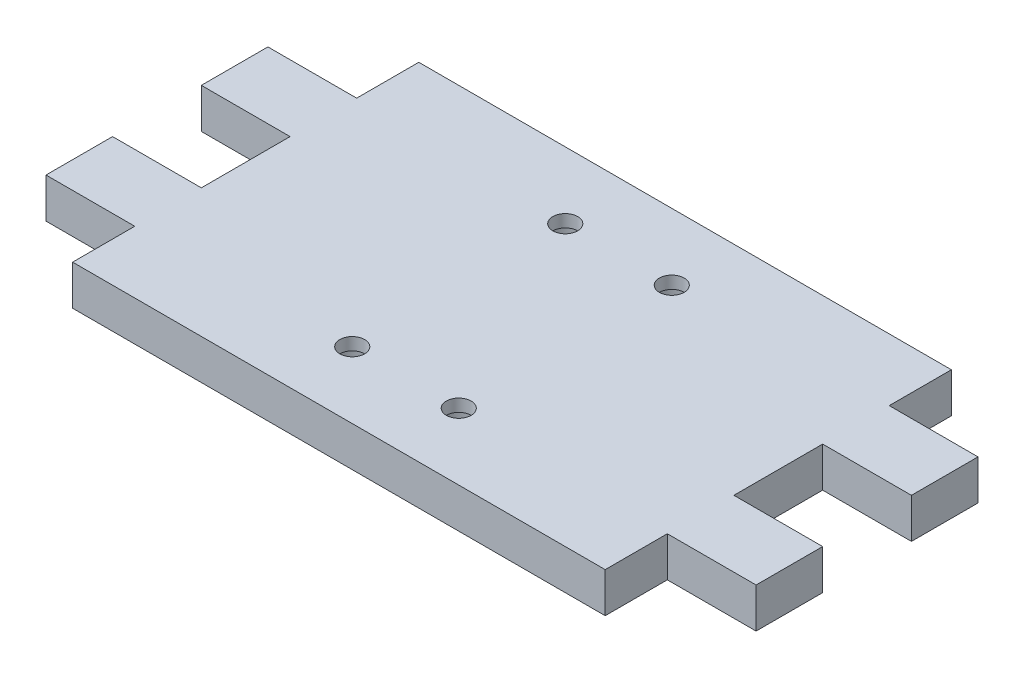
ISO-10303-21;
HEADER;
FILE_DESCRIPTION(('STEP AP214'),'2;1');
FILE_NAME('part.step','',(''),(''),'','','');
FILE_SCHEMA(('AUTOMOTIVE_DESIGN { 1 0 10303 214 1 1 1 1 }'));
ENDSEC;
DATA;
#1=APPLICATION_CONTEXT('core data for automotive mechanical design processes');
#2=APPLICATION_PROTOCOL_DEFINITION('international standard','automotive_design',2000,#1);
#3=PRODUCT_CONTEXT('',#1,'mechanical');
#4=PRODUCT('Part','Part','',(#3));
#5=PRODUCT_RELATED_PRODUCT_CATEGORY('part','',(#4));
#6=PRODUCT_DEFINITION_FORMATION('','',#4);
#7=PRODUCT_DEFINITION_CONTEXT('part definition',#1,'design');
#8=PRODUCT_DEFINITION('design','',#6,#7);
#9=PRODUCT_DEFINITION_SHAPE('','',#8);
#10=(LENGTH_UNIT() NAMED_UNIT(*) SI_UNIT(.MILLI.,.METRE.));
#11=(NAMED_UNIT(*) PLANE_ANGLE_UNIT() SI_UNIT($,.RADIAN.));
#12=(NAMED_UNIT(*) SI_UNIT($,.STERADIAN.) SOLID_ANGLE_UNIT());
#13=UNCERTAINTY_MEASURE_WITH_UNIT(LENGTH_MEASURE(1.E-05),#10,'distance_accuracy_value','');
#14=(GEOMETRIC_REPRESENTATION_CONTEXT(3) GLOBAL_UNCERTAINTY_ASSIGNED_CONTEXT((#13)) GLOBAL_UNIT_ASSIGNED_CONTEXT((#10,
#11,#12)) REPRESENTATION_CONTEXT('',''));
#15=CARTESIAN_POINT('',(0.,0.,0.));
#16=DIRECTION('',(0.,0.,1.));
#17=DIRECTION('',(1.,0.,0.));
#18=AXIS2_PLACEMENT_3D('',#15,#16,#17);
#19=CARTESIAN_POINT('',(-30.,0.,0.));
#20=DIRECTION('',(-1.,0.,0.));
#21=DIRECTION('',(0.,0.,1.));
#22=AXIS2_PLACEMENT_3D('',#19,#20,#21);
#23=PLANE('',#22);
#24=DIRECTION('',(0.,-1.,0.));
#25=VECTOR('',#24,1.);
#26=CARTESIAN_POINT('',(-30.,2.25,-5.));
#27=LINE('',#26,#25);
#28=CARTESIAN_POINT('',(-30.,2.25,-5.));
#29=VERTEX_POINT('',#28);
#30=CARTESIAN_POINT('',(-30.,-2.25,-5.));
#31=VERTEX_POINT('',#30);
#32=EDGE_CURVE('E176',#29,#31,#27,.T.);
#33=ORIENTED_EDGE('',*,*,#32,.T.);
#34=DIRECTION('',(0.,0.,-1.));
#35=VECTOR('',#34,1.);
#36=CARTESIAN_POINT('',(-30.,-2.25,12.5));
#37=LINE('',#36,#35);
#38=CARTESIAN_POINT('',(-30.,-2.25,5.));
#39=VERTEX_POINT('',#38);
#40=EDGE_CURVE('E320',#39,#31,#37,.T.);
#41=ORIENTED_EDGE('',*,*,#40,.F.);
#42=DIRECTION('',(0.,1.,0.));
#43=VECTOR('',#42,1.);
#44=CARTESIAN_POINT('',(-30.,2.25,5.));
#45=LINE('',#44,#43);
#46=CARTESIAN_POINT('',(-30.,2.25,5.));
#47=VERTEX_POINT('',#46);
#48=EDGE_CURVE('E210',#39,#47,#45,.T.);
#49=ORIENTED_EDGE('',*,*,#48,.T.);
#50=DIRECTION('',(0.,0.,1.));
#51=VECTOR('',#50,1.);
#52=CARTESIAN_POINT('',(-30.,2.25,12.5));
#53=LINE('',#52,#51);
#54=EDGE_CURVE('E56',#29,#47,#53,.T.);
#55=ORIENTED_EDGE('',*,*,#54,.F.);
#56=EDGE_LOOP('',(#33,#41,#49,#55));
#57=FACE_BOUND('',#56,.T.);
#58=ADVANCED_FACE('F33',(#57),#23,.T.);
#59=CARTESIAN_POINT('',(-30.,2.25,12.5));
#60=VERTEX_POINT('',#59);
#61=CARTESIAN_POINT('',(-30.,2.25,19.5));
#62=VERTEX_POINT('',#61);
#63=EDGE_CURVE('E308',#60,#62,#53,.T.);
#64=ORIENTED_EDGE('',*,*,#63,.F.);
#65=DIRECTION('',(0.,-1.,0.));
#66=VECTOR('',#65,1.);
#67=CARTESIAN_POINT('',(-30.,2.25,12.5));
#68=LINE('',#67,#66);
#69=CARTESIAN_POINT('',(-30.,-2.25,12.5));
#70=VERTEX_POINT('',#69);
#71=EDGE_CURVE('E178',#60,#70,#68,.T.);
#72=ORIENTED_EDGE('',*,*,#71,.T.);
#73=CARTESIAN_POINT('',(-30.,-2.25,19.5));
#74=VERTEX_POINT('',#73);
#75=EDGE_CURVE('E312',#74,#70,#37,.T.);
#76=ORIENTED_EDGE('',*,*,#75,.F.);
#77=DIRECTION('',(0.,-1.,0.));
#78=VECTOR('',#77,1.);
#79=CARTESIAN_POINT('',(-30.,2.25,19.5));
#80=LINE('',#79,#78);
#81=EDGE_CURVE('E251',#62,#74,#80,.T.);
#82=ORIENTED_EDGE('',*,*,#81,.F.);
#83=EDGE_LOOP('',(#64,#72,#76,#82));
#84=FACE_BOUND('',#83,.T.);
#85=ADVANCED_FACE('F340',(#84),#23,.T.);
#86=DIRECTION('',(0.,1.,0.));
#87=VECTOR('',#86,1.);
#88=CARTESIAN_POINT('',(-30.,2.25,-12.5));
#89=LINE('',#88,#87);
#90=CARTESIAN_POINT('',(-30.,-2.25,-12.5));
#91=VERTEX_POINT('',#90);
#92=CARTESIAN_POINT('',(-30.,2.25,-12.5));
#93=VERTEX_POINT('',#92);
#94=EDGE_CURVE('E48',#91,#93,#89,.T.);
#95=ORIENTED_EDGE('',*,*,#94,.T.);
#96=CARTESIAN_POINT('',(-30.,2.25,-19.5));
#97=VERTEX_POINT('',#96);
#98=EDGE_CURVE('E315',#97,#93,#53,.T.);
#99=ORIENTED_EDGE('',*,*,#98,.F.);
#100=DIRECTION('',(0.,-1.,0.));
#101=VECTOR('',#100,1.);
#102=CARTESIAN_POINT('',(-30.,2.25,-19.5));
#103=LINE('',#102,#101);
#104=CARTESIAN_POINT('',(-30.,-2.25,-19.5));
#105=VERTEX_POINT('',#104);
#106=EDGE_CURVE('E232',#97,#105,#103,.T.);
#107=ORIENTED_EDGE('',*,*,#106,.T.);
#108=EDGE_CURVE('E317',#91,#105,#37,.T.);
#109=ORIENTED_EDGE('',*,*,#108,.F.);
#110=EDGE_LOOP('',(#95,#99,#107,#109));
#111=FACE_BOUND('',#110,.T.);
#112=ADVANCED_FACE('F378',(#111),#23,.T.);
#113=CARTESIAN_POINT('',(30.,-2.25,12.5));
#114=DIRECTION('',(0.,0.,-1.));
#115=DIRECTION('',(-1.,0.,0.));
#116=AXIS2_PLACEMENT_3D('',#113,#114,#115);
#117=PLANE('',#116);
#118=DIRECTION('',(0.,1.,0.));
#119=VECTOR('',#118,1.);
#120=CARTESIAN_POINT('',(30.,2.25,12.5));
#121=LINE('',#120,#119);
#122=CARTESIAN_POINT('',(30.,-2.25,12.5));
#123=VERTEX_POINT('',#122);
#124=CARTESIAN_POINT('',(30.,2.25,12.5));
#125=VERTEX_POINT('',#124);
#126=EDGE_CURVE('E250',#123,#125,#121,.T.);
#127=ORIENTED_EDGE('',*,*,#126,.F.);
#128=DIRECTION('',(-1.,0.,0.));
#129=VECTOR('',#128,1.);
#130=CARTESIAN_POINT('',(30.,-2.25,12.5));
#131=LINE('',#130,#129);
#132=CARTESIAN_POINT('',(40.,-2.25,12.5));
#133=VERTEX_POINT('',#132);
#134=EDGE_CURVE('E323',#133,#123,#131,.T.);
#135=ORIENTED_EDGE('',*,*,#134,.F.);
#136=DIRECTION('',(0.,-1.,0.));
#137=VECTOR('',#136,1.);
#138=CARTESIAN_POINT('',(40.,2.25,12.5));
#139=LINE('',#138,#137);
#140=CARTESIAN_POINT('',(40.,2.25,12.5));
#141=VERTEX_POINT('',#140);
#142=EDGE_CURVE('E290',#141,#133,#139,.T.);
#143=ORIENTED_EDGE('',*,*,#142,.F.);
#144=DIRECTION('',(-1.,0.,0.));
#145=VECTOR('',#144,1.);
#146=CARTESIAN_POINT('',(30.,2.25,12.5));
#147=LINE('',#146,#145);
#148=EDGE_CURVE('E41',#141,#125,#147,.T.);
#149=ORIENTED_EDGE('',*,*,#148,.T.);
#150=EDGE_LOOP('',(#127,#135,#143,#149));
#151=FACE_BOUND('',#150,.T.);
#152=ADVANCED_FACE('F327',(#151),#117,.F.);
#153=CARTESIAN_POINT('',(30.,0.,0.));
#154=DIRECTION('',(-1.,0.,0.));
#155=DIRECTION('',(0.,0.,1.));
#156=AXIS2_PLACEMENT_3D('',#153,#154,#155);
#157=PLANE('',#156);
#158=DIRECTION('',(0.,-1.,0.));
#159=VECTOR('',#158,1.);
#160=CARTESIAN_POINT('',(30.,2.25,-5.));
#161=LINE('',#160,#159);
#162=CARTESIAN_POINT('',(30.,2.25,-5.));
#163=VERTEX_POINT('',#162);
#164=CARTESIAN_POINT('',(30.,-2.25,-5.));
#165=VERTEX_POINT('',#164);
#166=EDGE_CURVE('E269',#163,#165,#161,.T.);
#167=ORIENTED_EDGE('',*,*,#166,.F.);
#168=DIRECTION('',(0.,0.,1.));
#169=VECTOR('',#168,1.);
#170=CARTESIAN_POINT('',(30.,2.25,12.5));
#171=LINE('',#170,#169);
#172=CARTESIAN_POINT('',(30.,2.25,5.));
#173=VERTEX_POINT('',#172);
#174=EDGE_CURVE('E309',#163,#173,#171,.T.);
#175=ORIENTED_EDGE('',*,*,#174,.T.);
#176=DIRECTION('',(0.,1.,0.));
#177=VECTOR('',#176,1.);
#178=CARTESIAN_POINT('',(30.,2.25,5.));
#179=LINE('',#178,#177);
#180=CARTESIAN_POINT('',(30.,-2.25,5.));
#181=VERTEX_POINT('',#180);
#182=EDGE_CURVE('E289',#181,#173,#179,.T.);
#183=ORIENTED_EDGE('',*,*,#182,.F.);
#184=DIRECTION('',(0.,0.,-1.));
#185=VECTOR('',#184,1.);
#186=CARTESIAN_POINT('',(30.,-2.25,12.5));
#187=LINE('',#186,#185);
#188=EDGE_CURVE('E311',#181,#165,#187,.T.);
#189=ORIENTED_EDGE('',*,*,#188,.T.);
#190=EDGE_LOOP('',(#167,#175,#183,#189));
#191=FACE_BOUND('',#190,.T.);
#192=ADVANCED_FACE('F357',(#191),#157,.F.);
#193=CARTESIAN_POINT('',(30.,-2.25,-12.5));
#194=DIRECTION('',(0.,0.,1.));
#195=DIRECTION('',(1.,0.,0.));
#196=AXIS2_PLACEMENT_3D('',#193,#194,#195);
#197=PLANE('',#196);
#198=DIRECTION('',(-1.,0.,0.));
#199=VECTOR('',#198,1.);
#200=CARTESIAN_POINT('',(30.,-2.25,-12.5));
#201=LINE('',#200,#199);
#202=CARTESIAN_POINT('',(40.,-2.25,-12.5));
#203=VERTEX_POINT('',#202);
#204=CARTESIAN_POINT('',(30.,-2.25,-12.5));
#205=VERTEX_POINT('',#204);
#206=EDGE_CURVE('E314',#203,#205,#201,.T.);
#207=ORIENTED_EDGE('',*,*,#206,.T.);
#208=DIRECTION('',(0.,1.,0.));
#209=VECTOR('',#208,1.);
#210=CARTESIAN_POINT('',(30.,2.25,-12.5));
#211=LINE('',#210,#209);
#212=CARTESIAN_POINT('',(30.,2.25,-12.5));
#213=VERTEX_POINT('',#212);
#214=EDGE_CURVE('E231',#205,#213,#211,.T.);
#215=ORIENTED_EDGE('',*,*,#214,.T.);
#216=DIRECTION('',(-1.,0.,0.));
#217=VECTOR('',#216,1.);
#218=CARTESIAN_POINT('',(30.,2.25,-12.5));
#219=LINE('',#218,#217);
#220=CARTESIAN_POINT('',(40.,2.25,-12.5));
#221=VERTEX_POINT('',#220);
#222=EDGE_CURVE('E11',#221,#213,#219,.T.);
#223=ORIENTED_EDGE('',*,*,#222,.F.);
#224=DIRECTION('',(0.,1.,0.));
#225=VECTOR('',#224,1.);
#226=CARTESIAN_POINT('',(40.,2.25,-12.5));
#227=LINE('',#226,#225);
#228=EDGE_CURVE('E276',#203,#221,#227,.T.);
#229=ORIENTED_EDGE('',*,*,#228,.F.);
#230=EDGE_LOOP('',(#207,#215,#223,#229));
#231=FACE_BOUND('',#230,.T.);
#232=ADVANCED_FACE('F35',(#231),#197,.F.);
#233=CARTESIAN_POINT('',(30.,2.25,12.5));
#234=DIRECTION('',(0.,-1.,0.));
#235=DIRECTION('',(0.,0.,-1.));
#236=AXIS2_PLACEMENT_3D('',#233,#234,#235);
#237=PLANE('',#236);
#238=CARTESIAN_POINT('',(6.,2.25,-12.));
#239=DIRECTION('',(0.,-1.,0.));
#240=DIRECTION('',(0.,0.,-1.));
#241=AXIS2_PLACEMENT_3D('',#238,#239,#240);
#242=CIRCLE('',#241,1.4);
#243=CARTESIAN_POINT('',(6.,2.25,-13.4));
#244=VERTEX_POINT('',#243);
#245=EDGE_CURVE('E426',#244,#244,#242,.T.);
#246=ORIENTED_EDGE('',*,*,#245,.T.);
#247=EDGE_LOOP('',(#246));
#248=FACE_BOUND('',#247,.T.);
#249=CARTESIAN_POINT('',(-6.,2.25,-12.));
#250=DIRECTION('',(0.,-1.,0.));
#251=DIRECTION('',(0.,0.,-1.));
#252=AXIS2_PLACEMENT_3D('',#249,#250,#251);
#253=CIRCLE('',#252,1.4);
#254=CARTESIAN_POINT('',(-6.,2.25,-13.4));
#255=VERTEX_POINT('',#254);
#256=EDGE_CURVE('E430',#255,#255,#253,.T.);
#257=ORIENTED_EDGE('',*,*,#256,.T.);
#258=EDGE_LOOP('',(#257));
#259=FACE_BOUND('',#258,.T.);
#260=CARTESIAN_POINT('',(-6.,2.25,12.));
#261=DIRECTION('',(0.,-1.,0.));
#262=DIRECTION('',(0.,0.,-1.));
#263=AXIS2_PLACEMENT_3D('',#260,#261,#262);
#264=CIRCLE('',#263,1.4);
#265=CARTESIAN_POINT('',(-6.,2.25,10.6));
#266=VERTEX_POINT('',#265);
#267=EDGE_CURVE('E434',#266,#266,#264,.T.);
#268=ORIENTED_EDGE('',*,*,#267,.T.);
#269=EDGE_LOOP('',(#268));
#270=FACE_BOUND('',#269,.T.);
#271=CARTESIAN_POINT('',(6.,2.25,12.));
#272=DIRECTION('',(0.,-1.,0.));
#273=DIRECTION('',(0.,0.,-1.));
#274=AXIS2_PLACEMENT_3D('',#271,#272,#273);
#275=CIRCLE('',#274,1.4);
#276=CARTESIAN_POINT('',(6.,2.25,10.6));
#277=VERTEX_POINT('',#276);
#278=EDGE_CURVE('E200',#277,#277,#275,.T.);
#279=ORIENTED_EDGE('',*,*,#278,.T.);
#280=EDGE_LOOP('',(#279));
#281=FACE_BOUND('',#280,.T.);
#282=ORIENTED_EDGE('',*,*,#98,.T.);
#283=DIRECTION('',(1.,0.,0.));
#284=VECTOR('',#283,1.);
#285=CARTESIAN_POINT('',(-40.,2.25,-12.5));
#286=LINE('',#285,#284);
#287=CARTESIAN_POINT('',(-40.,2.25,-12.5));
#288=VERTEX_POINT('',#287);
#289=EDGE_CURVE('E179',#288,#93,#286,.T.);
#290=ORIENTED_EDGE('',*,*,#289,.F.);
#291=DIRECTION('',(0.,0.,1.));
#292=VECTOR('',#291,1.);
#293=CARTESIAN_POINT('',(-40.,2.25,-5.));
#294=LINE('',#293,#292);
#295=CARTESIAN_POINT('',(-40.,2.25,-5.));
#296=VERTEX_POINT('',#295);
#297=EDGE_CURVE('E185',#288,#296,#294,.T.);
#298=ORIENTED_EDGE('',*,*,#297,.T.);
#299=DIRECTION('',(1.,0.,0.));
#300=VECTOR('',#299,1.);
#301=CARTESIAN_POINT('',(-40.,2.25,-5.));
#302=LINE('',#301,#300);
#303=EDGE_CURVE('E170',#296,#29,#302,.T.);
#304=ORIENTED_EDGE('',*,*,#303,.T.);
#305=ORIENTED_EDGE('',*,*,#54,.T.);
#306=DIRECTION('',(1.,0.,0.));
#307=VECTOR('',#306,1.);
#308=CARTESIAN_POINT('',(-40.,2.25,5.));
#309=LINE('',#308,#307);
#310=CARTESIAN_POINT('',(-40.,2.25,5.));
#311=VERTEX_POINT('',#310);
#312=EDGE_CURVE('E227',#311,#47,#309,.T.);
#313=ORIENTED_EDGE('',*,*,#312,.F.);
#314=DIRECTION('',(0.,0.,1.));
#315=VECTOR('',#314,1.);
#316=CARTESIAN_POINT('',(-40.,2.25,12.5));
#317=LINE('',#316,#315);
#318=CARTESIAN_POINT('',(-40.,2.25,12.5));
#319=VERTEX_POINT('',#318);
#320=EDGE_CURVE('E209',#311,#319,#317,.T.);
#321=ORIENTED_EDGE('',*,*,#320,.T.);
#322=DIRECTION('',(1.,0.,0.));
#323=VECTOR('',#322,1.);
#324=CARTESIAN_POINT('',(-40.,2.25,12.5));
#325=LINE('',#324,#323);
#326=EDGE_CURVE('E229',#319,#60,#325,.T.);
#327=ORIENTED_EDGE('',*,*,#326,.T.);
#328=ORIENTED_EDGE('',*,*,#63,.T.);
#329=DIRECTION('',(-1.,0.,0.));
#330=VECTOR('',#329,1.);
#331=CARTESIAN_POINT('',(-30.,2.25,19.5));
#332=LINE('',#331,#330);
#333=CARTESIAN_POINT('',(30.,2.25,19.5));
#334=VERTEX_POINT('',#333);
#335=EDGE_CURVE('E258',#334,#62,#332,.T.);
#336=ORIENTED_EDGE('',*,*,#335,.F.);
#337=DIRECTION('',(0.,0.,-1.));
#338=VECTOR('',#337,1.);
#339=CARTESIAN_POINT('',(30.,2.25,19.5));
#340=LINE('',#339,#338);
#341=EDGE_CURVE('E261',#334,#125,#340,.T.);
#342=ORIENTED_EDGE('',*,*,#341,.T.);
#343=ORIENTED_EDGE('',*,*,#148,.F.);
#344=DIRECTION('',(0.,0.,1.));
#345=VECTOR('',#344,1.);
#346=CARTESIAN_POINT('',(40.,2.25,12.5));
#347=LINE('',#346,#345);
#348=CARTESIAN_POINT('',(40.,2.25,5.));
#349=VERTEX_POINT('',#348);
#350=EDGE_CURVE('E297',#349,#141,#347,.T.);
#351=ORIENTED_EDGE('',*,*,#350,.F.);
#352=DIRECTION('',(-1.,0.,0.));
#353=VECTOR('',#352,1.);
#354=CARTESIAN_POINT('',(40.,2.25,5.));
#355=LINE('',#354,#353);
#356=EDGE_CURVE('E300',#349,#173,#355,.T.);
#357=ORIENTED_EDGE('',*,*,#356,.T.);
#358=ORIENTED_EDGE('',*,*,#174,.F.);
#359=DIRECTION('',(-1.,0.,0.));
#360=VECTOR('',#359,1.);
#361=CARTESIAN_POINT('',(40.,2.25,-5.));
#362=LINE('',#361,#360);
#363=CARTESIAN_POINT('',(40.,2.25,-5.));
#364=VERTEX_POINT('',#363);
#365=EDGE_CURVE('E281',#364,#163,#362,.T.);
#366=ORIENTED_EDGE('',*,*,#365,.F.);
#367=DIRECTION('',(0.,0.,1.));
#368=VECTOR('',#367,1.);
#369=CARTESIAN_POINT('',(40.,2.25,-5.));
#370=LINE('',#369,#368);
#371=EDGE_CURVE('E279',#221,#364,#370,.T.);
#372=ORIENTED_EDGE('',*,*,#371,.F.);
#373=ORIENTED_EDGE('',*,*,#222,.T.);
#374=DIRECTION('',(0.,0.,1.));
#375=VECTOR('',#374,1.);
#376=CARTESIAN_POINT('',(30.,2.25,-19.5));
#377=LINE('',#376,#375);
#378=CARTESIAN_POINT('',(30.,2.25,-19.5));
#379=VERTEX_POINT('',#378);
#380=EDGE_CURVE('E248',#379,#213,#377,.T.);
#381=ORIENTED_EDGE('',*,*,#380,.F.);
#382=DIRECTION('',(-1.,0.,0.));
#383=VECTOR('',#382,1.);
#384=CARTESIAN_POINT('',(-30.,2.25,-19.5));
#385=LINE('',#384,#383);
#386=EDGE_CURVE('E235',#379,#97,#385,.T.);
#387=ORIENTED_EDGE('',*,*,#386,.T.);
#388=EDGE_LOOP('',(#282,#290,#298,#304,#305,#313,#321,#327,#328,#336,#342,#343,#351,#357,#358,
#366,#372,#373,#381,#387));
#389=FACE_BOUND('',#388,.T.);
#390=ADVANCED_FACE('F191',(#248,#259,#270,#281,#389),#237,.F.);
#391=CARTESIAN_POINT('',(30.,-2.25,12.5));
#392=DIRECTION('',(0.,1.,0.));
#393=DIRECTION('',(0.,0.,1.));
#394=AXIS2_PLACEMENT_3D('',#391,#392,#393);
#395=PLANE('',#394);
#396=CARTESIAN_POINT('',(6.,-2.25,-12.));
#397=DIRECTION('',(0.,-1.,0.));
#398=DIRECTION('',(0.,0.,-1.));
#399=AXIS2_PLACEMENT_3D('',#396,#397,#398);
#400=CIRCLE('',#399,2.75);
#401=CARTESIAN_POINT('',(6.,-2.25,-14.75));
#402=VERTEX_POINT('',#401);
#403=EDGE_CURVE('E475',#402,#402,#400,.T.);
#404=ORIENTED_EDGE('',*,*,#403,.F.);
#405=EDGE_LOOP('',(#404));
#406=FACE_BOUND('',#405,.T.);
#407=CARTESIAN_POINT('',(-6.,-2.25,-12.));
#408=DIRECTION('',(0.,-1.,0.));
#409=DIRECTION('',(0.,0.,-1.));
#410=AXIS2_PLACEMENT_3D('',#407,#408,#409);
#411=CIRCLE('',#410,2.75);
#412=CARTESIAN_POINT('',(-6.,-2.25,-14.75));
#413=VERTEX_POINT('',#412);
#414=EDGE_CURVE('E465',#413,#413,#411,.T.);
#415=ORIENTED_EDGE('',*,*,#414,.F.);
#416=EDGE_LOOP('',(#415));
#417=FACE_BOUND('',#416,.T.);
#418=CARTESIAN_POINT('',(-6.,-2.25,12.));
#419=DIRECTION('',(0.,-1.,0.));
#420=DIRECTION('',(0.,0.,-1.));
#421=AXIS2_PLACEMENT_3D('',#418,#419,#420);
#422=CIRCLE('',#421,2.75);
#423=CARTESIAN_POINT('',(-6.,-2.25,9.25));
#424=VERTEX_POINT('',#423);
#425=EDGE_CURVE('E455',#424,#424,#422,.T.);
#426=ORIENTED_EDGE('',*,*,#425,.F.);
#427=EDGE_LOOP('',(#426));
#428=FACE_BOUND('',#427,.T.);
#429=CARTESIAN_POINT('',(6.,-2.25,12.));
#430=DIRECTION('',(0.,-1.,0.));
#431=DIRECTION('',(0.,0.,-1.));
#432=AXIS2_PLACEMENT_3D('',#429,#430,#431);
#433=CIRCLE('',#432,2.75);
#434=CARTESIAN_POINT('',(6.,-2.25,9.25));
#435=VERTEX_POINT('',#434);
#436=EDGE_CURVE('E445',#435,#435,#433,.T.);
#437=ORIENTED_EDGE('',*,*,#436,.F.);
#438=EDGE_LOOP('',(#437));
#439=FACE_BOUND('',#438,.T.);
#440=ORIENTED_EDGE('',*,*,#75,.T.);
#441=DIRECTION('',(1.,0.,0.));
#442=VECTOR('',#441,1.);
#443=CARTESIAN_POINT('',(-40.,-2.25,12.5));
#444=LINE('',#443,#442);
#445=CARTESIAN_POINT('',(-40.,-2.25,12.5));
#446=VERTEX_POINT('',#445);
#447=EDGE_CURVE('E219',#446,#70,#444,.T.);
#448=ORIENTED_EDGE('',*,*,#447,.F.);
#449=DIRECTION('',(0.,0.,-1.));
#450=VECTOR('',#449,1.);
#451=CARTESIAN_POINT('',(-40.,-2.25,12.5));
#452=LINE('',#451,#450);
#453=CARTESIAN_POINT('',(-40.,-2.25,5.));
#454=VERTEX_POINT('',#453);
#455=EDGE_CURVE('E216',#446,#454,#452,.T.);
#456=ORIENTED_EDGE('',*,*,#455,.T.);
#457=DIRECTION('',(1.,0.,0.));
#458=VECTOR('',#457,1.);
#459=CARTESIAN_POINT('',(-40.,-2.25,5.));
#460=LINE('',#459,#458);
#461=EDGE_CURVE('E225',#454,#39,#460,.T.);
#462=ORIENTED_EDGE('',*,*,#461,.T.);
#463=ORIENTED_EDGE('',*,*,#40,.T.);
#464=DIRECTION('',(1.,0.,0.));
#465=VECTOR('',#464,1.);
#466=CARTESIAN_POINT('',(-40.,-2.25,-5.));
#467=LINE('',#466,#465);
#468=CARTESIAN_POINT('',(-40.,-2.25,-5.));
#469=VERTEX_POINT('',#468);
#470=EDGE_CURVE('E198',#469,#31,#467,.T.);
#471=ORIENTED_EDGE('',*,*,#470,.F.);
#472=DIRECTION('',(0.,0.,-1.));
#473=VECTOR('',#472,1.);
#474=CARTESIAN_POINT('',(-40.,-2.25,-5.));
#475=LINE('',#474,#473);
#476=CARTESIAN_POINT('',(-40.,-2.25,-12.5));
#477=VERTEX_POINT('',#476);
#478=EDGE_CURVE('E188',#469,#477,#475,.T.);
#479=ORIENTED_EDGE('',*,*,#478,.T.);
#480=DIRECTION('',(1.,0.,0.));
#481=VECTOR('',#480,1.);
#482=CARTESIAN_POINT('',(-40.,-2.25,-12.5));
#483=LINE('',#482,#481);
#484=EDGE_CURVE('E203',#477,#91,#483,.T.);
#485=ORIENTED_EDGE('',*,*,#484,.T.);
#486=ORIENTED_EDGE('',*,*,#108,.T.);
#487=DIRECTION('',(1.,0.,0.));
#488=VECTOR('',#487,1.);
#489=CARTESIAN_POINT('',(-30.,-2.25,-19.5));
#490=LINE('',#489,#488);
#491=CARTESIAN_POINT('',(30.,-2.25,-19.5));
#492=VERTEX_POINT('',#491);
#493=EDGE_CURVE('E241',#105,#492,#490,.T.);
#494=ORIENTED_EDGE('',*,*,#493,.T.);
#495=DIRECTION('',(0.,0.,1.));
#496=VECTOR('',#495,1.);
#497=CARTESIAN_POINT('',(30.,-2.25,-19.5));
#498=LINE('',#497,#496);
#499=EDGE_CURVE('E244',#492,#205,#498,.T.);
#500=ORIENTED_EDGE('',*,*,#499,.T.);
#501=ORIENTED_EDGE('',*,*,#206,.F.);
#502=DIRECTION('',(0.,0.,-1.));
#503=VECTOR('',#502,1.);
#504=CARTESIAN_POINT('',(40.,-2.25,-5.));
#505=LINE('',#504,#503);
#506=CARTESIAN_POINT('',(40.,-2.25,-5.));
#507=VERTEX_POINT('',#506);
#508=EDGE_CURVE('E273',#507,#203,#505,.T.);
#509=ORIENTED_EDGE('',*,*,#508,.F.);
#510=DIRECTION('',(-1.,0.,0.));
#511=VECTOR('',#510,1.);
#512=CARTESIAN_POINT('',(40.,-2.25,-5.));
#513=LINE('',#512,#511);
#514=EDGE_CURVE('E286',#507,#165,#513,.T.);
#515=ORIENTED_EDGE('',*,*,#514,.T.);
#516=ORIENTED_EDGE('',*,*,#188,.F.);
#517=DIRECTION('',(-1.,0.,0.));
#518=VECTOR('',#517,1.);
#519=CARTESIAN_POINT('',(40.,-2.25,5.));
#520=LINE('',#519,#518);
#521=CARTESIAN_POINT('',(40.,-2.25,5.));
#522=VERTEX_POINT('',#521);
#523=EDGE_CURVE('E305',#522,#181,#520,.T.);
#524=ORIENTED_EDGE('',*,*,#523,.F.);
#525=DIRECTION('',(0.,0.,-1.));
#526=VECTOR('',#525,1.);
#527=CARTESIAN_POINT('',(40.,-2.25,12.5));
#528=LINE('',#527,#526);
#529=EDGE_CURVE('E293',#133,#522,#528,.T.);
#530=ORIENTED_EDGE('',*,*,#529,.F.);
#531=ORIENTED_EDGE('',*,*,#134,.T.);
#532=DIRECTION('',(0.,0.,-1.));
#533=VECTOR('',#532,1.);
#534=CARTESIAN_POINT('',(30.,-2.25,19.5));
#535=LINE('',#534,#533);
#536=CARTESIAN_POINT('',(30.,-2.25,19.5));
#537=VERTEX_POINT('',#536);
#538=EDGE_CURVE('E266',#537,#123,#535,.T.);
#539=ORIENTED_EDGE('',*,*,#538,.F.);
#540=DIRECTION('',(1.,0.,0.));
#541=VECTOR('',#540,1.);
#542=CARTESIAN_POINT('',(-30.,-2.25,19.5));
#543=LINE('',#542,#541);
#544=EDGE_CURVE('E254',#74,#537,#543,.T.);
#545=ORIENTED_EDGE('',*,*,#544,.F.);
#546=EDGE_LOOP('',(#440,#448,#456,#462,#463,#471,#479,#485,#486,#494,#500,#501,#509,#515,#516,
#524,#530,#531,#539,#545));
#547=FACE_BOUND('',#546,.T.);
#548=ADVANCED_FACE('F344',(#406,#417,#428,#439,#547),#395,.F.);
#549=CARTESIAN_POINT('',(40.,2.25,5.));
#550=DIRECTION('',(0.,0.,1.));
#551=DIRECTION('',(1.,0.,0.));
#552=AXIS2_PLACEMENT_3D('',#549,#550,#551);
#553=PLANE('',#552);
#554=ORIENTED_EDGE('',*,*,#182,.T.);
#555=ORIENTED_EDGE('',*,*,#356,.F.);
#556=DIRECTION('',(0.,1.,0.));
#557=VECTOR('',#556,1.);
#558=CARTESIAN_POINT('',(40.,2.25,5.));
#559=LINE('',#558,#557);
#560=EDGE_CURVE('E295',#522,#349,#559,.T.);
#561=ORIENTED_EDGE('',*,*,#560,.F.);
#562=ORIENTED_EDGE('',*,*,#523,.T.);
#563=EDGE_LOOP('',(#554,#555,#561,#562));
#564=FACE_BOUND('',#563,.T.);
#565=ADVANCED_FACE('F355',(#564),#553,.F.);
#566=CARTESIAN_POINT('',(40.,0.,0.));
#567=DIRECTION('',(1.,0.,0.));
#568=DIRECTION('',(0.,0.,-1.));
#569=AXIS2_PLACEMENT_3D('',#566,#567,#568);
#570=PLANE('',#569);
#571=ORIENTED_EDGE('',*,*,#142,.T.);
#572=ORIENTED_EDGE('',*,*,#529,.T.);
#573=ORIENTED_EDGE('',*,*,#560,.T.);
#574=ORIENTED_EDGE('',*,*,#350,.T.);
#575=EDGE_LOOP('',(#571,#572,#573,#574));
#576=FACE_BOUND('',#575,.T.);
#577=ADVANCED_FACE('F350',(#576),#570,.T.);
#578=CARTESIAN_POINT('',(40.,2.25,-5.));
#579=DIRECTION('',(0.,0.,-1.));
#580=DIRECTION('',(-1.,0.,0.));
#581=AXIS2_PLACEMENT_3D('',#578,#579,#580);
#582=PLANE('',#581);
#583=ORIENTED_EDGE('',*,*,#166,.T.);
#584=ORIENTED_EDGE('',*,*,#514,.F.);
#585=DIRECTION('',(0.,-1.,0.));
#586=VECTOR('',#585,1.);
#587=CARTESIAN_POINT('',(40.,2.25,-5.));
#588=LINE('',#587,#586);
#589=EDGE_CURVE('E270',#364,#507,#588,.T.);
#590=ORIENTED_EDGE('',*,*,#589,.F.);
#591=ORIENTED_EDGE('',*,*,#365,.T.);
#592=EDGE_LOOP('',(#583,#584,#590,#591));
#593=FACE_BOUND('',#592,.T.);
#594=ADVANCED_FACE('F361',(#593),#582,.F.);
#595=CARTESIAN_POINT('',(40.,0.,0.));
#596=DIRECTION('',(1.,0.,0.));
#597=DIRECTION('',(0.,0.,-1.));
#598=AXIS2_PLACEMENT_3D('',#595,#596,#597);
#599=PLANE('',#598);
#600=ORIENTED_EDGE('',*,*,#589,.T.);
#601=ORIENTED_EDGE('',*,*,#508,.T.);
#602=ORIENTED_EDGE('',*,*,#228,.T.);
#603=ORIENTED_EDGE('',*,*,#371,.T.);
#604=EDGE_LOOP('',(#600,#601,#602,#603));
#605=FACE_BOUND('',#604,.T.);
#606=ADVANCED_FACE('F364',(#605),#599,.T.);
#607=CARTESIAN_POINT('',(30.,2.25,19.5));
#608=DIRECTION('',(-1.,0.,0.));
#609=DIRECTION('',(0.,0.,1.));
#610=AXIS2_PLACEMENT_3D('',#607,#608,#609);
#611=PLANE('',#610);
#612=ORIENTED_EDGE('',*,*,#126,.T.);
#613=ORIENTED_EDGE('',*,*,#341,.F.);
#614=DIRECTION('',(0.,1.,0.));
#615=VECTOR('',#614,1.);
#616=CARTESIAN_POINT('',(30.,2.25,19.5));
#617=LINE('',#616,#615);
#618=EDGE_CURVE('E256',#537,#334,#617,.T.);
#619=ORIENTED_EDGE('',*,*,#618,.F.);
#620=ORIENTED_EDGE('',*,*,#538,.T.);
#621=EDGE_LOOP('',(#612,#613,#619,#620));
#622=FACE_BOUND('',#621,.T.);
#623=ADVANCED_FACE('F331',(#622),#611,.F.);
#624=CARTESIAN_POINT('',(0.,0.,19.5));
#625=DIRECTION('',(0.,0.,1.));
#626=DIRECTION('',(1.,0.,0.));
#627=AXIS2_PLACEMENT_3D('',#624,#625,#626);
#628=PLANE('',#627);
#629=ORIENTED_EDGE('',*,*,#81,.T.);
#630=ORIENTED_EDGE('',*,*,#544,.T.);
#631=ORIENTED_EDGE('',*,*,#618,.T.);
#632=ORIENTED_EDGE('',*,*,#335,.T.);
#633=EDGE_LOOP('',(#629,#630,#631,#632));
#634=FACE_BOUND('',#633,.T.);
#635=ADVANCED_FACE('F338',(#634),#628,.T.);
#636=CARTESIAN_POINT('',(30.,2.25,-19.5));
#637=DIRECTION('',(1.,0.,0.));
#638=DIRECTION('',(0.,0.,-1.));
#639=AXIS2_PLACEMENT_3D('',#636,#637,#638);
#640=PLANE('',#639);
#641=ORIENTED_EDGE('',*,*,#214,.F.);
#642=ORIENTED_EDGE('',*,*,#499,.F.);
#643=DIRECTION('',(0.,1.,0.));
#644=VECTOR('',#643,1.);
#645=CARTESIAN_POINT('',(30.,2.25,-19.5));
#646=LINE('',#645,#644);
#647=EDGE_CURVE('E238',#492,#379,#646,.T.);
#648=ORIENTED_EDGE('',*,*,#647,.T.);
#649=ORIENTED_EDGE('',*,*,#380,.T.);
#650=EDGE_LOOP('',(#641,#642,#648,#649));
#651=FACE_BOUND('',#650,.T.);
#652=ADVANCED_FACE('F369',(#651),#640,.T.);
#653=CARTESIAN_POINT('',(0.,0.,-19.5));
#654=DIRECTION('',(0.,0.,-1.));
#655=DIRECTION('',(1.,0.,0.));
#656=AXIS2_PLACEMENT_3D('',#653,#654,#655);
#657=PLANE('',#656);
#658=ORIENTED_EDGE('',*,*,#106,.F.);
#659=ORIENTED_EDGE('',*,*,#386,.F.);
#660=ORIENTED_EDGE('',*,*,#647,.F.);
#661=ORIENTED_EDGE('',*,*,#493,.F.);
#662=EDGE_LOOP('',(#658,#659,#660,#661));
#663=FACE_BOUND('',#662,.T.);
#664=ADVANCED_FACE('F374',(#663),#657,.T.);
#665=CARTESIAN_POINT('',(-40.,2.25,12.5));
#666=DIRECTION('',(0.,0.,1.));
#667=DIRECTION('',(1.,0.,0.));
#668=AXIS2_PLACEMENT_3D('',#665,#666,#667);
#669=PLANE('',#668);
#670=ORIENTED_EDGE('',*,*,#71,.F.);
#671=ORIENTED_EDGE('',*,*,#326,.F.);
#672=DIRECTION('',(0.,-1.,0.));
#673=VECTOR('',#672,1.);
#674=CARTESIAN_POINT('',(-40.,2.25,12.5));
#675=LINE('',#674,#673);
#676=EDGE_CURVE('E206',#319,#446,#675,.T.);
#677=ORIENTED_EDGE('',*,*,#676,.T.);
#678=ORIENTED_EDGE('',*,*,#447,.T.);
#679=EDGE_LOOP('',(#670,#671,#677,#678));
#680=FACE_BOUND('',#679,.T.);
#681=ADVANCED_FACE('F392',(#680),#669,.T.);
#682=CARTESIAN_POINT('',(-40.,2.25,5.));
#683=DIRECTION('',(0.,0.,-1.));
#684=DIRECTION('',(-1.,0.,0.));
#685=AXIS2_PLACEMENT_3D('',#682,#683,#684);
#686=PLANE('',#685);
#687=ORIENTED_EDGE('',*,*,#48,.F.);
#688=ORIENTED_EDGE('',*,*,#461,.F.);
#689=DIRECTION('',(0.,1.,0.));
#690=VECTOR('',#689,1.);
#691=CARTESIAN_POINT('',(-40.,2.25,5.));
#692=LINE('',#691,#690);
#693=EDGE_CURVE('E213',#454,#311,#692,.T.);
#694=ORIENTED_EDGE('',*,*,#693,.T.);
#695=ORIENTED_EDGE('',*,*,#312,.T.);
#696=EDGE_LOOP('',(#687,#688,#694,#695));
#697=FACE_BOUND('',#696,.T.);
#698=ADVANCED_FACE('F384',(#697),#686,.T.);
#699=CARTESIAN_POINT('',(-40.,0.,0.));
#700=DIRECTION('',(-1.,0.,0.));
#701=DIRECTION('',(0.,0.,-1.));
#702=AXIS2_PLACEMENT_3D('',#699,#700,#701);
#703=PLANE('',#702);
#704=ORIENTED_EDGE('',*,*,#676,.F.);
#705=ORIENTED_EDGE('',*,*,#320,.F.);
#706=ORIENTED_EDGE('',*,*,#693,.F.);
#707=ORIENTED_EDGE('',*,*,#455,.F.);
#708=EDGE_LOOP('',(#704,#705,#706,#707));
#709=FACE_BOUND('',#708,.T.);
#710=ADVANCED_FACE('F389',(#709),#703,.T.);
#711=CARTESIAN_POINT('',(-40.,2.25,-5.));
#712=DIRECTION('',(0.,0.,1.));
#713=DIRECTION('',(1.,0.,0.));
#714=AXIS2_PLACEMENT_3D('',#711,#712,#713);
#715=PLANE('',#714);
#716=ORIENTED_EDGE('',*,*,#32,.F.);
#717=ORIENTED_EDGE('',*,*,#303,.F.);
#718=DIRECTION('',(0.,-1.,0.));
#719=VECTOR('',#718,1.);
#720=CARTESIAN_POINT('',(-40.,2.25,-5.));
#721=LINE('',#720,#719);
#722=EDGE_CURVE('E173',#296,#469,#721,.T.);
#723=ORIENTED_EDGE('',*,*,#722,.T.);
#724=ORIENTED_EDGE('',*,*,#470,.T.);
#725=EDGE_LOOP('',(#716,#717,#723,#724));
#726=FACE_BOUND('',#725,.T.);
#727=ADVANCED_FACE('F172',(#726),#715,.T.);
#728=CARTESIAN_POINT('',(-40.,2.25,-12.5));
#729=DIRECTION('',(0.,0.,-1.));
#730=DIRECTION('',(-1.,0.,0.));
#731=AXIS2_PLACEMENT_3D('',#728,#729,#730);
#732=PLANE('',#731);
#733=ORIENTED_EDGE('',*,*,#94,.F.);
#734=ORIENTED_EDGE('',*,*,#484,.F.);
#735=DIRECTION('',(0.,1.,0.));
#736=VECTOR('',#735,1.);
#737=CARTESIAN_POINT('',(-40.,2.25,-12.5));
#738=LINE('',#737,#736);
#739=EDGE_CURVE('E192',#477,#288,#738,.T.);
#740=ORIENTED_EDGE('',*,*,#739,.T.);
#741=ORIENTED_EDGE('',*,*,#289,.T.);
#742=EDGE_LOOP('',(#733,#734,#740,#741));
#743=FACE_BOUND('',#742,.T.);
#744=ADVANCED_FACE('F510',(#743),#732,.T.);
#745=CARTESIAN_POINT('',(-40.,0.,0.));
#746=DIRECTION('',(-1.,0.,0.));
#747=DIRECTION('',(0.,0.,-1.));
#748=AXIS2_PLACEMENT_3D('',#745,#746,#747);
#749=PLANE('',#748);
#750=ORIENTED_EDGE('',*,*,#722,.F.);
#751=ORIENTED_EDGE('',*,*,#297,.F.);
#752=ORIENTED_EDGE('',*,*,#739,.F.);
#753=ORIENTED_EDGE('',*,*,#478,.F.);
#754=EDGE_LOOP('',(#750,#751,#752,#753));
#755=FACE_BOUND('',#754,.T.);
#756=ADVANCED_FACE('F183',(#755),#749,.T.);
#757=CARTESIAN_POINT('',(6.,-2.25,12.));
#758=DIRECTION('',(0.,-1.,0.));
#759=DIRECTION('',(0.,0.,-1.));
#760=AXIS2_PLACEMENT_3D('',#757,#758,#759);
#761=CYLINDRICAL_SURFACE('',#760,1.4);
#762=ORIENTED_EDGE('',*,*,#278,.F.);
#763=EDGE_LOOP('',(#762));
#764=FACE_BOUND('',#763,.T.);
#765=CARTESIAN_POINT('',(6.,0.850000000000001,12.));
#766=DIRECTION('',(0.,-1.,0.));
#767=DIRECTION('',(0.,0.,-1.));
#768=AXIS2_PLACEMENT_3D('',#765,#766,#767);
#769=CIRCLE('',#768,1.4);
#770=CARTESIAN_POINT('',(6.,0.850000000000001,10.6));
#771=VERTEX_POINT('',#770);
#772=EDGE_CURVE('E438',#771,#771,#769,.T.);
#773=ORIENTED_EDGE('',*,*,#772,.T.);
#774=EDGE_LOOP('',(#773));
#775=FACE_BOUND('',#774,.T.);
#776=ADVANCED_FACE('F500',(#764,#775),#761,.F.);
#777=CARTESIAN_POINT('',(7.4,0.850000000000001,12.));
#778=DIRECTION('',(0.,1.,0.));
#779=DIRECTION('',(0.,0.,1.));
#780=AXIS2_PLACEMENT_3D('',#777,#778,#779);
#781=PLANE('',#780);
#782=ORIENTED_EDGE('',*,*,#772,.F.);
#783=EDGE_LOOP('',(#782));
#784=FACE_BOUND('',#783,.T.);
#785=CARTESIAN_POINT('',(6.,0.850000000000001,12.));
#786=DIRECTION('',(0.,-1.,0.));
#787=DIRECTION('',(0.,0.,-1.));
#788=AXIS2_PLACEMENT_3D('',#785,#786,#787);
#789=CIRCLE('',#788,2.75);
#790=CARTESIAN_POINT('',(6.,0.850000000000001,9.25));
#791=VERTEX_POINT('',#790);
#792=EDGE_CURVE('E440',#791,#791,#789,.T.);
#793=ORIENTED_EDGE('',*,*,#792,.T.);
#794=EDGE_LOOP('',(#793));
#795=FACE_BOUND('',#794,.T.);
#796=ADVANCED_FACE('F490',(#784,#795),#781,.F.);
#797=CARTESIAN_POINT('',(6.,-2.25,12.));
#798=DIRECTION('',(0.,-1.,0.));
#799=DIRECTION('',(0.,0.,-1.));
#800=AXIS2_PLACEMENT_3D('',#797,#798,#799);
#801=CYLINDRICAL_SURFACE('',#800,2.75);
#802=ORIENTED_EDGE('',*,*,#792,.F.);
#803=EDGE_LOOP('',(#802));
#804=FACE_BOUND('',#803,.T.);
#805=ORIENTED_EDGE('',*,*,#436,.T.);
#806=EDGE_LOOP('',(#805));
#807=FACE_BOUND('',#806,.T.);
#808=ADVANCED_FACE('F487',(#804,#807),#801,.F.);
#809=CARTESIAN_POINT('',(-6.,-2.25,12.));
#810=DIRECTION('',(0.,-1.,0.));
#811=DIRECTION('',(0.,0.,-1.));
#812=AXIS2_PLACEMENT_3D('',#809,#810,#811);
#813=CYLINDRICAL_SURFACE('',#812,1.4);
#814=ORIENTED_EDGE('',*,*,#267,.F.);
#815=EDGE_LOOP('',(#814));
#816=FACE_BOUND('',#815,.T.);
#817=CARTESIAN_POINT('',(-6.,0.850000000000001,12.));
#818=DIRECTION('',(0.,-1.,0.));
#819=DIRECTION('',(0.,0.,-1.));
#820=AXIS2_PLACEMENT_3D('',#817,#818,#819);
#821=CIRCLE('',#820,1.4);
#822=CARTESIAN_POINT('',(-6.,0.850000000000001,10.6));
#823=VERTEX_POINT('',#822);
#824=EDGE_CURVE('E449',#823,#823,#821,.T.);
#825=ORIENTED_EDGE('',*,*,#824,.T.);
#826=EDGE_LOOP('',(#825));
#827=FACE_BOUND('',#826,.T.);
#828=ADVANCED_FACE('F489',(#816,#827),#813,.F.);
#829=CARTESIAN_POINT('',(-4.6,0.850000000000001,12.));
#830=DIRECTION('',(0.,1.,0.));
#831=DIRECTION('',(0.,0.,1.));
#832=AXIS2_PLACEMENT_3D('',#829,#830,#831);
#833=PLANE('',#832);
#834=ORIENTED_EDGE('',*,*,#824,.F.);
#835=EDGE_LOOP('',(#834));
#836=FACE_BOUND('',#835,.T.);
#837=CARTESIAN_POINT('',(-6.,0.850000000000001,12.));
#838=DIRECTION('',(0.,-1.,0.));
#839=DIRECTION('',(0.,0.,-1.));
#840=AXIS2_PLACEMENT_3D('',#837,#838,#839);
#841=CIRCLE('',#840,2.75);
#842=CARTESIAN_POINT('',(-6.,0.850000000000001,9.25));
#843=VERTEX_POINT('',#842);
#844=EDGE_CURVE('E452',#843,#843,#841,.T.);
#845=ORIENTED_EDGE('',*,*,#844,.T.);
#846=EDGE_LOOP('',(#845));
#847=FACE_BOUND('',#846,.T.);
#848=ADVANCED_FACE('F497',(#836,#847),#833,.F.);
#849=CARTESIAN_POINT('',(-6.,-2.25,12.));
#850=DIRECTION('',(0.,-1.,0.));
#851=DIRECTION('',(0.,0.,-1.));
#852=AXIS2_PLACEMENT_3D('',#849,#850,#851);
#853=CYLINDRICAL_SURFACE('',#852,2.75);
#854=ORIENTED_EDGE('',*,*,#844,.F.);
#855=EDGE_LOOP('',(#854));
#856=FACE_BOUND('',#855,.T.);
#857=ORIENTED_EDGE('',*,*,#425,.T.);
#858=EDGE_LOOP('',(#857));
#859=FACE_BOUND('',#858,.T.);
#860=ADVANCED_FACE('F560',(#856,#859),#853,.F.);
#861=CARTESIAN_POINT('',(-6.,-2.25,-12.));
#862=DIRECTION('',(0.,-1.,0.));
#863=DIRECTION('',(0.,0.,-1.));
#864=AXIS2_PLACEMENT_3D('',#861,#862,#863);
#865=CYLINDRICAL_SURFACE('',#864,1.4);
#866=ORIENTED_EDGE('',*,*,#256,.F.);
#867=EDGE_LOOP('',(#866));
#868=FACE_BOUND('',#867,.T.);
#869=CARTESIAN_POINT('',(-6.,0.850000000000001,-12.));
#870=DIRECTION('',(0.,-1.,0.));
#871=DIRECTION('',(0.,0.,-1.));
#872=AXIS2_PLACEMENT_3D('',#869,#870,#871);
#873=CIRCLE('',#872,1.4);
#874=CARTESIAN_POINT('',(-6.,0.850000000000001,-13.4));
#875=VERTEX_POINT('',#874);
#876=EDGE_CURVE('E459',#875,#875,#873,.T.);
#877=ORIENTED_EDGE('',*,*,#876,.T.);
#878=EDGE_LOOP('',(#877));
#879=FACE_BOUND('',#878,.T.);
#880=ADVANCED_FACE('F569',(#868,#879),#865,.F.);
#881=CARTESIAN_POINT('',(-4.6,0.850000000000001,-12.));
#882=DIRECTION('',(0.,1.,0.));
#883=DIRECTION('',(0.,0.,1.));
#884=AXIS2_PLACEMENT_3D('',#881,#882,#883);
#885=PLANE('',#884);
#886=ORIENTED_EDGE('',*,*,#876,.F.);
#887=EDGE_LOOP('',(#886));
#888=FACE_BOUND('',#887,.T.);
#889=CARTESIAN_POINT('',(-6.,0.850000000000001,-12.));
#890=DIRECTION('',(0.,-1.,0.));
#891=DIRECTION('',(0.,0.,-1.));
#892=AXIS2_PLACEMENT_3D('',#889,#890,#891);
#893=CIRCLE('',#892,2.75);
#894=CARTESIAN_POINT('',(-6.,0.850000000000001,-14.75));
#895=VERTEX_POINT('',#894);
#896=EDGE_CURVE('E462',#895,#895,#893,.T.);
#897=ORIENTED_EDGE('',*,*,#896,.T.);
#898=EDGE_LOOP('',(#897));
#899=FACE_BOUND('',#898,.T.);
#900=ADVANCED_FACE('F579',(#888,#899),#885,.F.);
#901=CARTESIAN_POINT('',(-6.,-2.25,-12.));
#902=DIRECTION('',(0.,-1.,0.));
#903=DIRECTION('',(0.,0.,-1.));
#904=AXIS2_PLACEMENT_3D('',#901,#902,#903);
#905=CYLINDRICAL_SURFACE('',#904,2.75);
#906=ORIENTED_EDGE('',*,*,#896,.F.);
#907=EDGE_LOOP('',(#906));
#908=FACE_BOUND('',#907,.T.);
#909=ORIENTED_EDGE('',*,*,#414,.T.);
#910=EDGE_LOOP('',(#909));
#911=FACE_BOUND('',#910,.T.);
#912=ADVANCED_FACE('F589',(#908,#911),#905,.F.);
#913=CARTESIAN_POINT('',(6.,-2.25,-12.));
#914=DIRECTION('',(0.,-1.,0.));
#915=DIRECTION('',(0.,0.,-1.));
#916=AXIS2_PLACEMENT_3D('',#913,#914,#915);
#917=CYLINDRICAL_SURFACE('',#916,1.4);
#918=ORIENTED_EDGE('',*,*,#245,.F.);
#919=EDGE_LOOP('',(#918));
#920=FACE_BOUND('',#919,.T.);
#921=CARTESIAN_POINT('',(6.,0.850000000000001,-12.));
#922=DIRECTION('',(0.,-1.,0.));
#923=DIRECTION('',(0.,0.,-1.));
#924=AXIS2_PLACEMENT_3D('',#921,#922,#923);
#925=CIRCLE('',#924,1.4);
#926=CARTESIAN_POINT('',(6.,0.850000000000001,-13.4));
#927=VERTEX_POINT('',#926);
#928=EDGE_CURVE('E469',#927,#927,#925,.T.);
#929=ORIENTED_EDGE('',*,*,#928,.T.);
#930=EDGE_LOOP('',(#929));
#931=FACE_BOUND('',#930,.T.);
#932=ADVANCED_FACE('F599',(#920,#931),#917,.F.);
#933=CARTESIAN_POINT('',(7.4,0.850000000000001,-12.));
#934=DIRECTION('',(0.,1.,0.));
#935=DIRECTION('',(0.,0.,1.));
#936=AXIS2_PLACEMENT_3D('',#933,#934,#935);
#937=PLANE('',#936);
#938=ORIENTED_EDGE('',*,*,#928,.F.);
#939=EDGE_LOOP('',(#938));
#940=FACE_BOUND('',#939,.T.);
#941=CARTESIAN_POINT('',(6.,0.850000000000001,-12.));
#942=DIRECTION('',(0.,-1.,0.));
#943=DIRECTION('',(0.,0.,-1.));
#944=AXIS2_PLACEMENT_3D('',#941,#942,#943);
#945=CIRCLE('',#944,2.75);
#946=CARTESIAN_POINT('',(6.,0.850000000000001,-14.75));
#947=VERTEX_POINT('',#946);
#948=EDGE_CURVE('E472',#947,#947,#945,.T.);
#949=ORIENTED_EDGE('',*,*,#948,.T.);
#950=EDGE_LOOP('',(#949));
#951=FACE_BOUND('',#950,.T.);
#952=ADVANCED_FACE('F609',(#940,#951),#937,.F.);
#953=CARTESIAN_POINT('',(6.,-2.25,-12.));
#954=DIRECTION('',(0.,-1.,0.));
#955=DIRECTION('',(0.,0.,-1.));
#956=AXIS2_PLACEMENT_3D('',#953,#954,#955);
#957=CYLINDRICAL_SURFACE('',#956,2.75);
#958=ORIENTED_EDGE('',*,*,#948,.F.);
#959=EDGE_LOOP('',(#958));
#960=FACE_BOUND('',#959,.T.);
#961=ORIENTED_EDGE('',*,*,#403,.T.);
#962=EDGE_LOOP('',(#961));
#963=FACE_BOUND('',#962,.T.);
#964=ADVANCED_FACE('F479',(#960,#963),#957,.F.);
#965=CLOSED_SHELL('',(#58,#85,#112,#152,#192,#232,#390,#548,#565,#577,#594,#606,#623,#635,#652,
#664,#681,#698,#710,#727,#744,#756,#776,#796,#808,#828,#848,#860,#880,#900,#912,#932,#952,#964));
#966=MANIFOLD_SOLID_BREP('B2',#965);
#967=ADVANCED_BREP_SHAPE_REPRESENTATION('',(#18,#966),#14);
#968=SHAPE_DEFINITION_REPRESENTATION(#9,#967);
ENDSEC;
END-ISO-10303-21;
